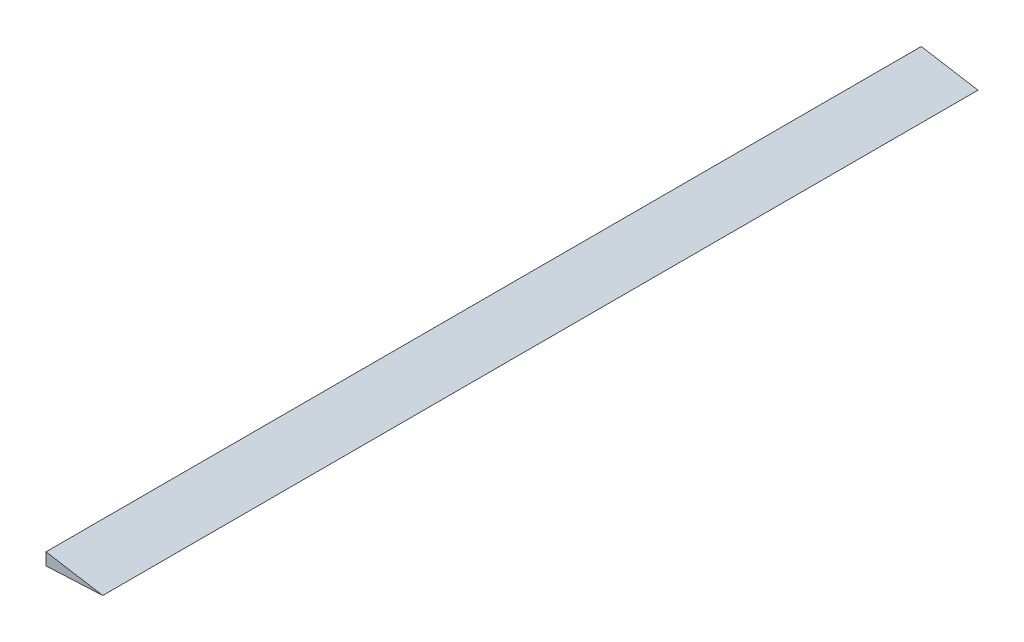
ISO-10303-21;
HEADER;
FILE_DESCRIPTION(('STEP AP214'),'2;1');
FILE_NAME('part.step','',(''),(''),'','','');
FILE_SCHEMA(('AUTOMOTIVE_DESIGN { 1 0 10303 214 1 1 1 1 }'));
ENDSEC;
DATA;
#1=APPLICATION_CONTEXT('core data for automotive mechanical design processes');
#2=APPLICATION_PROTOCOL_DEFINITION('international standard','automotive_design',2000,#1);
#3=PRODUCT_CONTEXT('',#1,'mechanical');
#4=PRODUCT('Part','Part','',(#3));
#5=PRODUCT_RELATED_PRODUCT_CATEGORY('part','',(#4));
#6=PRODUCT_DEFINITION_FORMATION('','',#4);
#7=PRODUCT_DEFINITION_CONTEXT('part definition',#1,'design');
#8=PRODUCT_DEFINITION('design','',#6,#7);
#9=PRODUCT_DEFINITION_SHAPE('','',#8);
#10=(LENGTH_UNIT() NAMED_UNIT(*) SI_UNIT(.MILLI.,.METRE.));
#11=(NAMED_UNIT(*) PLANE_ANGLE_UNIT() SI_UNIT($,.RADIAN.));
#12=(NAMED_UNIT(*) SI_UNIT($,.STERADIAN.) SOLID_ANGLE_UNIT());
#13=UNCERTAINTY_MEASURE_WITH_UNIT(LENGTH_MEASURE(1.E-05),#10,'distance_accuracy_value','');
#14=(GEOMETRIC_REPRESENTATION_CONTEXT(3) GLOBAL_UNCERTAINTY_ASSIGNED_CONTEXT((#13)) GLOBAL_UNIT_ASSIGNED_CONTEXT((#10,
#11,#12)) REPRESENTATION_CONTEXT('',''));
#15=CARTESIAN_POINT('',(0.,0.,0.));
#16=DIRECTION('',(0.,0.,1.));
#17=DIRECTION('',(1.,0.,0.));
#18=AXIS2_PLACEMENT_3D('',#15,#16,#17);
#19=CARTESIAN_POINT('',(306.849576799999,-2.51611574111238,21.3362540000001));
#20=DIRECTION('',(0.0494691955585382,-0.998775649828725,0.));
#21=DIRECTION('',(0.998775649828725,0.0494691955585382,0.));
#22=AXIS2_PLACEMENT_3D('',#19,#20,#21);
#23=PLANE('',#22);
#24=DIRECTION('',(-0.998775649828725,-0.0494691955585382,0.));
#25=VECTOR('',#24,1.);
#26=CARTESIAN_POINT('',(306.849576799999,-2.51611574111238,-761.999746));
#27=LINE('',#26,#25);
#28=CARTESIAN_POINT('',(357.6495768,0.,-761.999746));
#29=VERTEX_POINT('',#28);
#30=CARTESIAN_POINT('',(306.849576799999,-2.51611574111238,-761.999746));
#31=VERTEX_POINT('',#30);
#32=EDGE_CURVE('E90',#29,#31,#27,.T.);
#33=ORIENTED_EDGE('',*,*,#32,.F.);
#34=DIRECTION('',(0.,0.,-1.));
#35=VECTOR('',#34,1.);
#36=CARTESIAN_POINT('',(357.6495768,0.,21.3362540000001));
#37=LINE('',#36,#35);
#38=CARTESIAN_POINT('',(357.6495768,0.,21.3362540000001));
#39=VERTEX_POINT('',#38);
#40=EDGE_CURVE('E11',#39,#29,#37,.T.);
#41=ORIENTED_EDGE('',*,*,#40,.F.);
#42=DIRECTION('',(-0.998775649828725,-0.0494691955585382,0.));
#43=VECTOR('',#42,1.);
#44=CARTESIAN_POINT('',(306.849576799999,-2.51611574111238,21.3362540000001));
#45=LINE('',#44,#43);
#46=CARTESIAN_POINT('',(306.849576799999,-2.51611574111238,21.3362540000001));
#47=VERTEX_POINT('',#46);
#48=EDGE_CURVE('E82',#39,#47,#45,.T.);
#49=ORIENTED_EDGE('',*,*,#48,.T.);
#50=DIRECTION('',(0.,0.,-1.));
#51=VECTOR('',#50,1.);
#52=CARTESIAN_POINT('',(306.849576799999,-2.51611574111238,21.3362540000001));
#53=LINE('',#52,#51);
#54=EDGE_CURVE('E41',#47,#31,#53,.T.);
#55=ORIENTED_EDGE('',*,*,#54,.T.);
#56=EDGE_LOOP('',(#33,#41,#49,#55));
#57=FACE_BOUND('',#56,.T.);
#58=ADVANCED_FACE('F38',(#57),#23,.T.);
#59=CARTESIAN_POINT('',(306.8495768,8.44985600136988,21.3362540000001));
#60=DIRECTION('',(0.164081367708129,0.986446807877155,0.));
#61=DIRECTION('',(-0.986446807877156,0.164081367708129,0.));
#62=AXIS2_PLACEMENT_3D('',#59,#60,#61);
#63=PLANE('',#62);
#64=DIRECTION('',(0.986446807877156,-0.164081367708129,0.));
#65=VECTOR('',#64,1.);
#66=CARTESIAN_POINT('',(306.8495768,8.44985600136988,-761.999746));
#67=LINE('',#66,#65);
#68=CARTESIAN_POINT('',(306.8495768,8.44985600136988,-761.999746));
#69=VERTEX_POINT('',#68);
#70=EDGE_CURVE('E84',#69,#29,#67,.T.);
#71=ORIENTED_EDGE('',*,*,#70,.F.);
#72=DIRECTION('',(0.,0.,-1.));
#73=VECTOR('',#72,1.);
#74=CARTESIAN_POINT('',(306.8495768,8.44985600136988,21.3362540000001));
#75=LINE('',#74,#73);
#76=CARTESIAN_POINT('',(306.8495768,8.44985600136988,21.3362540000001));
#77=VERTEX_POINT('',#76);
#78=EDGE_CURVE('E47',#77,#69,#75,.T.);
#79=ORIENTED_EDGE('',*,*,#78,.F.);
#80=DIRECTION('',(0.986446807877156,-0.164081367708129,0.));
#81=VECTOR('',#80,1.);
#82=CARTESIAN_POINT('',(306.8495768,8.44985600136988,21.3362540000001));
#83=LINE('',#82,#81);
#84=EDGE_CURVE('E79',#77,#39,#83,.T.);
#85=ORIENTED_EDGE('',*,*,#84,.T.);
#86=ORIENTED_EDGE('',*,*,#40,.T.);
#87=EDGE_LOOP('',(#71,#79,#85,#86));
#88=FACE_BOUND('',#87,.T.);
#89=ADVANCED_FACE('F94',(#88),#63,.T.);
#90=CARTESIAN_POINT('',(306.849576799999,-2.51611574111238,21.3362540000001));
#91=DIRECTION('',(-1.,1.16428941119077E-13,0.));
#92=DIRECTION('',(-1.16428941119077E-13,-1.,0.));
#93=AXIS2_PLACEMENT_3D('',#90,#91,#92);
#94=PLANE('',#93);
#95=DIRECTION('',(1.16428941119077E-13,1.,0.));
#96=VECTOR('',#95,1.);
#97=CARTESIAN_POINT('',(306.849576799999,-2.51611574111238,-761.999746));
#98=LINE('',#97,#96);
#99=EDGE_CURVE('E77',#31,#69,#98,.T.);
#100=ORIENTED_EDGE('',*,*,#99,.F.);
#101=ORIENTED_EDGE('',*,*,#54,.F.);
#102=DIRECTION('',(1.16428941119077E-13,1.,0.));
#103=VECTOR('',#102,1.);
#104=CARTESIAN_POINT('',(306.849576799999,-2.51611574111238,21.3362540000001));
#105=LINE('',#104,#103);
#106=EDGE_CURVE('E75',#47,#77,#105,.T.);
#107=ORIENTED_EDGE('',*,*,#106,.T.);
#108=ORIENTED_EDGE('',*,*,#78,.T.);
#109=EDGE_LOOP('',(#100,#101,#107,#108));
#110=FACE_BOUND('',#109,.T.);
#111=ADVANCED_FACE('F74',(#110),#94,.T.);
#112=CARTESIAN_POINT('',(0.,0.,21.3362540000001));
#113=DIRECTION('',(0.,0.,1.));
#114=DIRECTION('',(1.,0.,0.));
#115=AXIS2_PLACEMENT_3D('',#112,#113,#114);
#116=PLANE('',#115);
#117=ORIENTED_EDGE('',*,*,#48,.F.);
#118=ORIENTED_EDGE('',*,*,#84,.F.);
#119=ORIENTED_EDGE('',*,*,#106,.F.);
#120=EDGE_LOOP('',(#117,#118,#119));
#121=FACE_BOUND('',#120,.T.);
#122=ADVANCED_FACE('F81',(#121),#116,.T.);
#123=CARTESIAN_POINT('',(0.,0.,-761.999746));
#124=DIRECTION('',(0.,0.,1.));
#125=DIRECTION('',(1.,0.,0.));
#126=AXIS2_PLACEMENT_3D('',#123,#124,#125);
#127=PLANE('',#126);
#128=ORIENTED_EDGE('',*,*,#32,.T.);
#129=ORIENTED_EDGE('',*,*,#99,.T.);
#130=ORIENTED_EDGE('',*,*,#70,.T.);
#131=EDGE_LOOP('',(#128,#129,#130));
#132=FACE_BOUND('',#131,.T.);
#133=ADVANCED_FACE('F93',(#132),#127,.F.);
#134=CLOSED_SHELL('',(#58,#89,#111,#122,#133));
#135=MANIFOLD_SOLID_BREP('B2',#134);
#136=ADVANCED_BREP_SHAPE_REPRESENTATION('',(#18,#135),#14);
#137=SHAPE_DEFINITION_REPRESENTATION(#9,#136);
ENDSEC;
END-ISO-10303-21;
